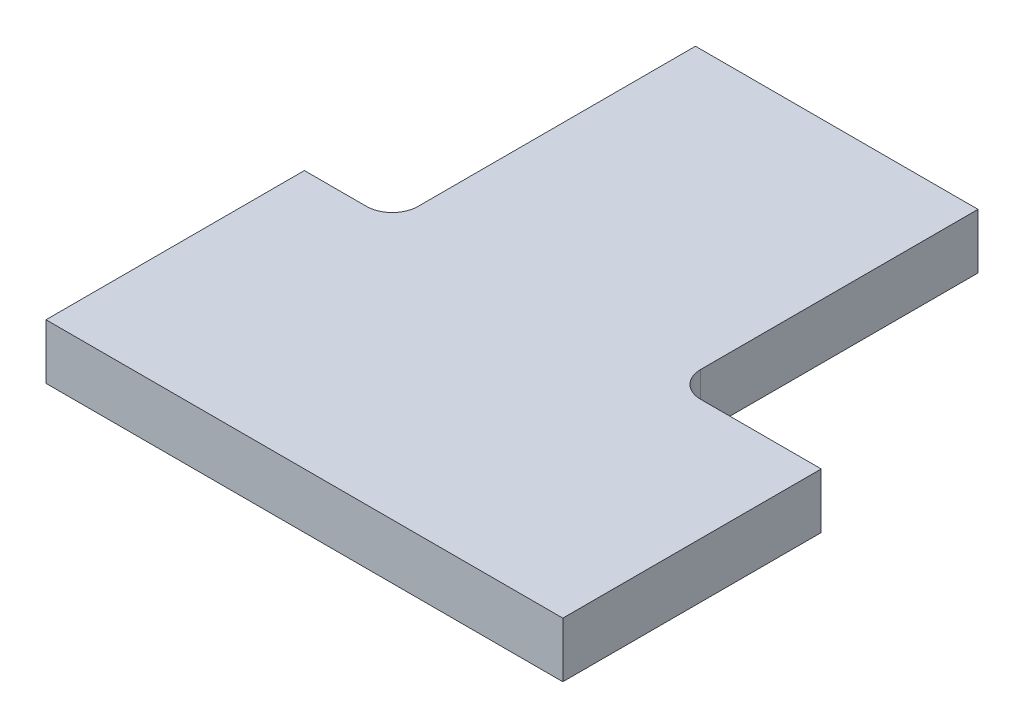
ISO-10303-21;
HEADER;
FILE_DESCRIPTION(('STEP AP214'),'2;1');
FILE_NAME('part.step','',(''),(''),'','','');
FILE_SCHEMA(('AUTOMOTIVE_DESIGN { 1 0 10303 214 1 1 1 1 }'));
ENDSEC;
DATA;
#1=APPLICATION_CONTEXT('core data for automotive mechanical design processes');
#2=APPLICATION_PROTOCOL_DEFINITION('international standard','automotive_design',2000,#1);
#3=PRODUCT_CONTEXT('',#1,'mechanical');
#4=PRODUCT('Part','Part','',(#3));
#5=PRODUCT_RELATED_PRODUCT_CATEGORY('part','',(#4));
#6=PRODUCT_DEFINITION_FORMATION('','',#4);
#7=PRODUCT_DEFINITION_CONTEXT('part definition',#1,'design');
#8=PRODUCT_DEFINITION('design','',#6,#7);
#9=PRODUCT_DEFINITION_SHAPE('','',#8);
#10=(LENGTH_UNIT() NAMED_UNIT(*) SI_UNIT(.MILLI.,.METRE.));
#11=(NAMED_UNIT(*) PLANE_ANGLE_UNIT() SI_UNIT($,.RADIAN.));
#12=(NAMED_UNIT(*) SI_UNIT($,.STERADIAN.) SOLID_ANGLE_UNIT());
#13=UNCERTAINTY_MEASURE_WITH_UNIT(LENGTH_MEASURE(1.E-05),#10,'distance_accuracy_value','');
#14=(GEOMETRIC_REPRESENTATION_CONTEXT(3) GLOBAL_UNCERTAINTY_ASSIGNED_CONTEXT((#13)) GLOBAL_UNIT_ASSIGNED_CONTEXT((#10,
#11,#12)) REPRESENTATION_CONTEXT('',''));
#15=CARTESIAN_POINT('',(0.,0.,0.));
#16=DIRECTION('',(0.,0.,1.));
#17=DIRECTION('',(1.,0.,0.));
#18=AXIS2_PLACEMENT_3D('',#15,#16,#17);
#19=CARTESIAN_POINT('',(0.,0.,0.));
#20=DIRECTION('',(0.,1.,0.));
#21=DIRECTION('',(1.,0.,0.));
#22=AXIS2_PLACEMENT_3D('',#19,#20,#21);
#23=PLANE('',#22);
#24=DIRECTION('',(0.,0.,1.));
#25=VECTOR('',#24,1.);
#26=CARTESIAN_POINT('',(-4.95,0.,0.));
#27=LINE('',#26,#25);
#28=CARTESIAN_POINT('',(-4.95,0.,-12.55));
#29=VERTEX_POINT('',#28);
#30=CARTESIAN_POINT('',(-4.95,0.,-4.5));
#31=VERTEX_POINT('',#30);
#32=EDGE_CURVE('E196',#29,#31,#27,.T.);
#33=ORIENTED_EDGE('',*,*,#32,.F.);
#34=DIRECTION('',(-1.,0.,0.));
#35=VECTOR('',#34,1.);
#36=CARTESIAN_POINT('',(0.,0.,-12.55));
#37=LINE('',#36,#35);
#38=CARTESIAN_POINT('',(3.25,0.,-12.55));
#39=VERTEX_POINT('',#38);
#40=EDGE_CURVE('E28',#39,#29,#37,.T.);
#41=ORIENTED_EDGE('',*,*,#40,.F.);
#42=DIRECTION('',(0.,0.,1.));
#43=VECTOR('',#42,1.);
#44=CARTESIAN_POINT('',(3.25,0.,0.));
#45=LINE('',#44,#43);
#46=CARTESIAN_POINT('',(3.25,0.,-4.5));
#47=VERTEX_POINT('',#46);
#48=EDGE_CURVE('E92',#39,#47,#45,.T.);
#49=ORIENTED_EDGE('',*,*,#48,.T.);
#50=CARTESIAN_POINT('',(4.,0.,-4.5));
#51=DIRECTION('',(0.,1.,0.));
#52=DIRECTION('',(0.,0.,1.));
#53=AXIS2_PLACEMENT_3D('',#50,#51,#52);
#54=CIRCLE('',#53,0.75);
#55=CARTESIAN_POINT('',(4.,0.,-3.75));
#56=VERTEX_POINT('',#55);
#57=EDGE_CURVE('E184',#47,#56,#54,.T.);
#58=ORIENTED_EDGE('',*,*,#57,.T.);
#59=DIRECTION('',(1.,0.,0.));
#60=VECTOR('',#59,1.);
#61=CARTESIAN_POINT('',(0.,0.,-3.75));
#62=LINE('',#61,#60);
#63=CARTESIAN_POINT('',(7.5,0.,-3.75));
#64=VERTEX_POINT('',#63);
#65=EDGE_CURVE('E156',#56,#64,#62,.T.);
#66=ORIENTED_EDGE('',*,*,#65,.T.);
#67=DIRECTION('',(0.,0.,1.));
#68=VECTOR('',#67,1.);
#69=CARTESIAN_POINT('',(7.5,0.,0.));
#70=LINE('',#69,#68);
#71=CARTESIAN_POINT('',(7.5,0.,3.75));
#72=VERTEX_POINT('',#71);
#73=EDGE_CURVE('E204',#64,#72,#70,.T.);
#74=ORIENTED_EDGE('',*,*,#73,.T.);
#75=DIRECTION('',(1.,0.,0.));
#76=VECTOR('',#75,1.);
#77=CARTESIAN_POINT('',(0.,0.,3.75));
#78=LINE('',#77,#76);
#79=CARTESIAN_POINT('',(-7.5,0.,3.75));
#80=VERTEX_POINT('',#79);
#81=EDGE_CURVE('E135',#80,#72,#78,.T.);
#82=ORIENTED_EDGE('',*,*,#81,.F.);
#83=DIRECTION('',(0.,0.,1.));
#84=VECTOR('',#83,1.);
#85=CARTESIAN_POINT('',(-7.5,0.,0.));
#86=LINE('',#85,#84);
#87=CARTESIAN_POINT('',(-7.5,0.,-3.75));
#88=VERTEX_POINT('',#87);
#89=EDGE_CURVE('E117',#88,#80,#86,.T.);
#90=ORIENTED_EDGE('',*,*,#89,.F.);
#91=DIRECTION('',(1.,0.,0.));
#92=VECTOR('',#91,1.);
#93=CARTESIAN_POINT('',(0.,0.,-3.75));
#94=LINE('',#93,#92);
#95=CARTESIAN_POINT('',(-5.7,0.,-3.75));
#96=VERTEX_POINT('',#95);
#97=EDGE_CURVE('E147',#88,#96,#94,.T.);
#98=ORIENTED_EDGE('',*,*,#97,.T.);
#99=CARTESIAN_POINT('',(-5.7,0.,-4.5));
#100=DIRECTION('',(0.,-1.,0.));
#101=DIRECTION('',(0.,0.,1.));
#102=AXIS2_PLACEMENT_3D('',#99,#100,#101);
#103=CIRCLE('',#102,0.75);
#104=EDGE_CURVE('E162',#31,#96,#103,.T.);
#105=ORIENTED_EDGE('',*,*,#104,.F.);
#106=EDGE_LOOP('',(#33,#41,#49,#58,#66,#74,#82,#90,#98,#105));
#107=FACE_BOUND('',#106,.T.);
#108=ADVANCED_FACE('F17',(#107),#23,.F.);
#109=CARTESIAN_POINT('',(0.,1.6,0.));
#110=DIRECTION('',(0.,1.,0.));
#111=DIRECTION('',(1.,0.,0.));
#112=AXIS2_PLACEMENT_3D('',#109,#110,#111);
#113=PLANE('',#112);
#114=DIRECTION('',(0.,0.,1.));
#115=VECTOR('',#114,1.);
#116=CARTESIAN_POINT('',(-4.95,1.6,0.));
#117=LINE('',#116,#115);
#118=CARTESIAN_POINT('',(-4.95,1.6,-12.55));
#119=VERTEX_POINT('',#118);
#120=CARTESIAN_POINT('',(-4.95,1.6,-4.5));
#121=VERTEX_POINT('',#120);
#122=EDGE_CURVE('E158',#119,#121,#117,.T.);
#123=ORIENTED_EDGE('',*,*,#122,.T.);
#124=CARTESIAN_POINT('',(-5.7,1.6,-4.5));
#125=DIRECTION('',(0.,-1.,0.));
#126=DIRECTION('',(0.,0.,1.));
#127=AXIS2_PLACEMENT_3D('',#124,#125,#126);
#128=CIRCLE('',#127,0.75);
#129=CARTESIAN_POINT('',(-5.7,1.6,-3.75));
#130=VERTEX_POINT('',#129);
#131=EDGE_CURVE('E141',#121,#130,#128,.T.);
#132=ORIENTED_EDGE('',*,*,#131,.T.);
#133=DIRECTION('',(1.,0.,0.));
#134=VECTOR('',#133,1.);
#135=CARTESIAN_POINT('',(0.,1.6,-3.75));
#136=LINE('',#135,#134);
#137=CARTESIAN_POINT('',(-7.5,1.6,-3.75));
#138=VERTEX_POINT('',#137);
#139=EDGE_CURVE('E138',#138,#130,#136,.T.);
#140=ORIENTED_EDGE('',*,*,#139,.F.);
#141=DIRECTION('',(0.,0.,1.));
#142=VECTOR('',#141,1.);
#143=CARTESIAN_POINT('',(-7.5,1.6,0.));
#144=LINE('',#143,#142);
#145=CARTESIAN_POINT('',(-7.5,1.6,3.75));
#146=VERTEX_POINT('',#145);
#147=EDGE_CURVE('E124',#138,#146,#144,.T.);
#148=ORIENTED_EDGE('',*,*,#147,.T.);
#149=DIRECTION('',(1.,0.,0.));
#150=VECTOR('',#149,1.);
#151=CARTESIAN_POINT('',(0.,1.6,3.75));
#152=LINE('',#151,#150);
#153=CARTESIAN_POINT('',(7.5,1.6,3.75));
#154=VERTEX_POINT('',#153);
#155=EDGE_CURVE('E191',#146,#154,#152,.T.);
#156=ORIENTED_EDGE('',*,*,#155,.T.);
#157=DIRECTION('',(0.,0.,1.));
#158=VECTOR('',#157,1.);
#159=CARTESIAN_POINT('',(7.5,1.6,0.));
#160=LINE('',#159,#158);
#161=CARTESIAN_POINT('',(7.5,1.6,-3.75));
#162=VERTEX_POINT('',#161);
#163=EDGE_CURVE('E198',#162,#154,#160,.T.);
#164=ORIENTED_EDGE('',*,*,#163,.F.);
#165=DIRECTION('',(1.,0.,0.));
#166=VECTOR('',#165,1.);
#167=CARTESIAN_POINT('',(0.,1.6,-3.75));
#168=LINE('',#167,#166);
#169=CARTESIAN_POINT('',(4.,1.6,-3.75));
#170=VERTEX_POINT('',#169);
#171=EDGE_CURVE('E172',#170,#162,#168,.T.);
#172=ORIENTED_EDGE('',*,*,#171,.F.);
#173=CARTESIAN_POINT('',(4.,1.6,-4.5));
#174=DIRECTION('',(0.,1.,0.));
#175=DIRECTION('',(0.,0.,1.));
#176=AXIS2_PLACEMENT_3D('',#173,#174,#175);
#177=CIRCLE('',#176,0.75);
#178=CARTESIAN_POINT('',(3.25,1.6,-4.5));
#179=VERTEX_POINT('',#178);
#180=EDGE_CURVE('E176',#179,#170,#177,.T.);
#181=ORIENTED_EDGE('',*,*,#180,.F.);
#182=DIRECTION('',(0.,0.,1.));
#183=VECTOR('',#182,1.);
#184=CARTESIAN_POINT('',(3.25,1.6,0.));
#185=LINE('',#184,#183);
#186=CARTESIAN_POINT('',(3.25,1.6,-12.55));
#187=VERTEX_POINT('',#186);
#188=EDGE_CURVE('E81',#187,#179,#185,.T.);
#189=ORIENTED_EDGE('',*,*,#188,.F.);
#190=DIRECTION('',(-1.,0.,0.));
#191=VECTOR('',#190,1.);
#192=CARTESIAN_POINT('',(0.,1.6,-12.55));
#193=LINE('',#192,#191);
#194=EDGE_CURVE('E11',#187,#119,#193,.T.);
#195=ORIENTED_EDGE('',*,*,#194,.T.);
#196=EDGE_LOOP('',(#123,#132,#140,#148,#156,#164,#172,#181,#189,#195));
#197=FACE_BOUND('',#196,.T.);
#198=ADVANCED_FACE('F140',(#197),#113,.T.);
#199=CARTESIAN_POINT('',(0.,1.6,-12.55));
#200=DIRECTION('',(0.,0.,1.));
#201=DIRECTION('',(1.,0.,0.));
#202=AXIS2_PLACEMENT_3D('',#199,#200,#201);
#203=PLANE('',#202);
#204=ORIENTED_EDGE('',*,*,#40,.T.);
#205=DIRECTION('',(0.,-1.,0.));
#206=VECTOR('',#205,1.);
#207=CARTESIAN_POINT('',(-4.95,1.6,-12.55));
#208=LINE('',#207,#206);
#209=EDGE_CURVE('E160',#119,#29,#208,.T.);
#210=ORIENTED_EDGE('',*,*,#209,.F.);
#211=ORIENTED_EDGE('',*,*,#194,.F.);
#212=DIRECTION('',(0.,-1.,0.));
#213=VECTOR('',#212,1.);
#214=CARTESIAN_POINT('',(3.25,1.6,-12.55));
#215=LINE('',#214,#213);
#216=EDGE_CURVE('E175',#187,#39,#215,.T.);
#217=ORIENTED_EDGE('',*,*,#216,.T.);
#218=EDGE_LOOP('',(#204,#210,#211,#217));
#219=FACE_BOUND('',#218,.T.);
#220=ADVANCED_FACE('F258',(#219),#203,.F.);
#221=CARTESIAN_POINT('',(3.25,1.6,0.));
#222=DIRECTION('',(1.,0.,0.));
#223=DIRECTION('',(0.,0.,1.));
#224=AXIS2_PLACEMENT_3D('',#221,#222,#223);
#225=PLANE('',#224);
#226=ORIENTED_EDGE('',*,*,#48,.F.);
#227=ORIENTED_EDGE('',*,*,#216,.F.);
#228=ORIENTED_EDGE('',*,*,#188,.T.);
#229=DIRECTION('',(0.,-1.,0.));
#230=VECTOR('',#229,1.);
#231=CARTESIAN_POINT('',(3.25,1.6,-4.5));
#232=LINE('',#231,#230);
#233=EDGE_CURVE('E179',#179,#47,#232,.T.);
#234=ORIENTED_EDGE('',*,*,#233,.T.);
#235=EDGE_LOOP('',(#226,#227,#228,#234));
#236=FACE_BOUND('',#235,.T.);
#237=ADVANCED_FACE('F304',(#236),#225,.T.);
#238=CARTESIAN_POINT('',(4.,1.6,-4.5));
#239=DIRECTION('',(0.,-1.,0.));
#240=DIRECTION('',(0.,0.,-1.));
#241=AXIS2_PLACEMENT_3D('',#238,#239,#240);
#242=CYLINDRICAL_SURFACE('',#241,0.75);
#243=ORIENTED_EDGE('',*,*,#57,.F.);
#244=ORIENTED_EDGE('',*,*,#233,.F.);
#245=ORIENTED_EDGE('',*,*,#180,.T.);
#246=DIRECTION('',(0.,-1.,0.));
#247=VECTOR('',#246,1.);
#248=CARTESIAN_POINT('',(4.,1.6,-3.75));
#249=LINE('',#248,#247);
#250=EDGE_CURVE('E168',#170,#56,#249,.T.);
#251=ORIENTED_EDGE('',*,*,#250,.T.);
#252=EDGE_LOOP('',(#243,#244,#245,#251));
#253=FACE_BOUND('',#252,.T.);
#254=ADVANCED_FACE('F251',(#253),#242,.F.);
#255=CARTESIAN_POINT('',(0.,1.6,-3.75));
#256=DIRECTION('',(0.,0.,-1.));
#257=DIRECTION('',(0.,-1.,0.));
#258=AXIS2_PLACEMENT_3D('',#255,#256,#257);
#259=PLANE('',#258);
#260=ORIENTED_EDGE('',*,*,#65,.F.);
#261=ORIENTED_EDGE('',*,*,#250,.F.);
#262=ORIENTED_EDGE('',*,*,#171,.T.);
#263=DIRECTION('',(0.,-1.,0.));
#264=VECTOR('',#263,1.);
#265=CARTESIAN_POINT('',(7.5,1.6,-3.75));
#266=LINE('',#265,#264);
#267=EDGE_CURVE('E201',#162,#64,#266,.T.);
#268=ORIENTED_EDGE('',*,*,#267,.T.);
#269=EDGE_LOOP('',(#260,#261,#262,#268));
#270=FACE_BOUND('',#269,.T.);
#271=ADVANCED_FACE('F228',(#270),#259,.T.);
#272=CARTESIAN_POINT('',(7.5,1.6,0.));
#273=DIRECTION('',(1.,0.,0.));
#274=DIRECTION('',(0.,0.,-1.));
#275=AXIS2_PLACEMENT_3D('',#272,#273,#274);
#276=PLANE('',#275);
#277=ORIENTED_EDGE('',*,*,#73,.F.);
#278=ORIENTED_EDGE('',*,*,#267,.F.);
#279=ORIENTED_EDGE('',*,*,#163,.T.);
#280=DIRECTION('',(0.,-1.,0.));
#281=VECTOR('',#280,1.);
#282=CARTESIAN_POINT('',(7.5,1.6,3.75));
#283=LINE('',#282,#281);
#284=EDGE_CURVE('E187',#154,#72,#283,.T.);
#285=ORIENTED_EDGE('',*,*,#284,.T.);
#286=EDGE_LOOP('',(#277,#278,#279,#285));
#287=FACE_BOUND('',#286,.T.);
#288=ADVANCED_FACE('F236',(#287),#276,.T.);
#289=CARTESIAN_POINT('',(0.,1.6,3.75));
#290=DIRECTION('',(0.,0.,-1.));
#291=DIRECTION('',(0.,-1.,0.));
#292=AXIS2_PLACEMENT_3D('',#289,#290,#291);
#293=PLANE('',#292);
#294=ORIENTED_EDGE('',*,*,#81,.T.);
#295=ORIENTED_EDGE('',*,*,#284,.F.);
#296=ORIENTED_EDGE('',*,*,#155,.F.);
#297=DIRECTION('',(0.,-1.,0.));
#298=VECTOR('',#297,1.);
#299=CARTESIAN_POINT('',(-7.5,1.6,3.75));
#300=LINE('',#299,#298);
#301=EDGE_CURVE('E131',#146,#80,#300,.T.);
#302=ORIENTED_EDGE('',*,*,#301,.T.);
#303=EDGE_LOOP('',(#294,#295,#296,#302));
#304=FACE_BOUND('',#303,.T.);
#305=ADVANCED_FACE('F248',(#304),#293,.F.);
#306=CARTESIAN_POINT('',(-7.5,1.6,0.));
#307=DIRECTION('',(1.,0.,0.));
#308=DIRECTION('',(0.,0.,-1.));
#309=AXIS2_PLACEMENT_3D('',#306,#307,#308);
#310=PLANE('',#309);
#311=ORIENTED_EDGE('',*,*,#89,.T.);
#312=ORIENTED_EDGE('',*,*,#301,.F.);
#313=ORIENTED_EDGE('',*,*,#147,.F.);
#314=DIRECTION('',(0.,-1.,0.));
#315=VECTOR('',#314,1.);
#316=CARTESIAN_POINT('',(-7.5,1.6,-3.75));
#317=LINE('',#316,#315);
#318=EDGE_CURVE('E128',#138,#88,#317,.T.);
#319=ORIENTED_EDGE('',*,*,#318,.T.);
#320=EDGE_LOOP('',(#311,#312,#313,#319));
#321=FACE_BOUND('',#320,.T.);
#322=ADVANCED_FACE('F126',(#321),#310,.F.);
#323=CARTESIAN_POINT('',(0.,1.6,-3.75));
#324=DIRECTION('',(0.,0.,-1.));
#325=DIRECTION('',(0.,-1.,0.));
#326=AXIS2_PLACEMENT_3D('',#323,#324,#325);
#327=PLANE('',#326);
#328=ORIENTED_EDGE('',*,*,#97,.F.);
#329=ORIENTED_EDGE('',*,*,#318,.F.);
#330=ORIENTED_EDGE('',*,*,#139,.T.);
#331=DIRECTION('',(0.,-1.,0.));
#332=VECTOR('',#331,1.);
#333=CARTESIAN_POINT('',(-5.7,1.6,-3.75));
#334=LINE('',#333,#332);
#335=EDGE_CURVE('E21',#130,#96,#334,.T.);
#336=ORIENTED_EDGE('',*,*,#335,.T.);
#337=EDGE_LOOP('',(#328,#329,#330,#336));
#338=FACE_BOUND('',#337,.T.);
#339=ADVANCED_FACE('F19',(#338),#327,.T.);
#340=CARTESIAN_POINT('',(-5.7,1.6,-4.5));
#341=DIRECTION('',(0.,-1.,0.));
#342=DIRECTION('',(0.,0.,-1.));
#343=AXIS2_PLACEMENT_3D('',#340,#341,#342);
#344=CYLINDRICAL_SURFACE('',#343,0.75);
#345=ORIENTED_EDGE('',*,*,#104,.T.);
#346=ORIENTED_EDGE('',*,*,#335,.F.);
#347=ORIENTED_EDGE('',*,*,#131,.F.);
#348=DIRECTION('',(0.,-1.,0.));
#349=VECTOR('',#348,1.);
#350=CARTESIAN_POINT('',(-4.95,1.6,-4.5));
#351=LINE('',#350,#349);
#352=EDGE_CURVE('E161',#121,#31,#351,.T.);
#353=ORIENTED_EDGE('',*,*,#352,.T.);
#354=EDGE_LOOP('',(#345,#346,#347,#353));
#355=FACE_BOUND('',#354,.T.);
#356=ADVANCED_FACE('F262',(#355),#344,.F.);
#357=CARTESIAN_POINT('',(-4.95,1.6,0.));
#358=DIRECTION('',(1.,0.,0.));
#359=DIRECTION('',(0.,1.,0.));
#360=AXIS2_PLACEMENT_3D('',#357,#358,#359);
#361=PLANE('',#360);
#362=ORIENTED_EDGE('',*,*,#32,.T.);
#363=ORIENTED_EDGE('',*,*,#352,.F.);
#364=ORIENTED_EDGE('',*,*,#122,.F.);
#365=ORIENTED_EDGE('',*,*,#209,.T.);
#366=EDGE_LOOP('',(#362,#363,#364,#365));
#367=FACE_BOUND('',#366,.T.);
#368=ADVANCED_FACE('F260',(#367),#361,.F.);
#369=CLOSED_SHELL('',(#108,#198,#220,#237,#254,#271,#288,#305,#322,#339,#356,#368));
#370=MANIFOLD_SOLID_BREP('B1',#369);
#371=ADVANCED_BREP_SHAPE_REPRESENTATION('',(#18,#370),#14);
#372=SHAPE_DEFINITION_REPRESENTATION(#9,#371);
ENDSEC;
END-ISO-10303-21;
